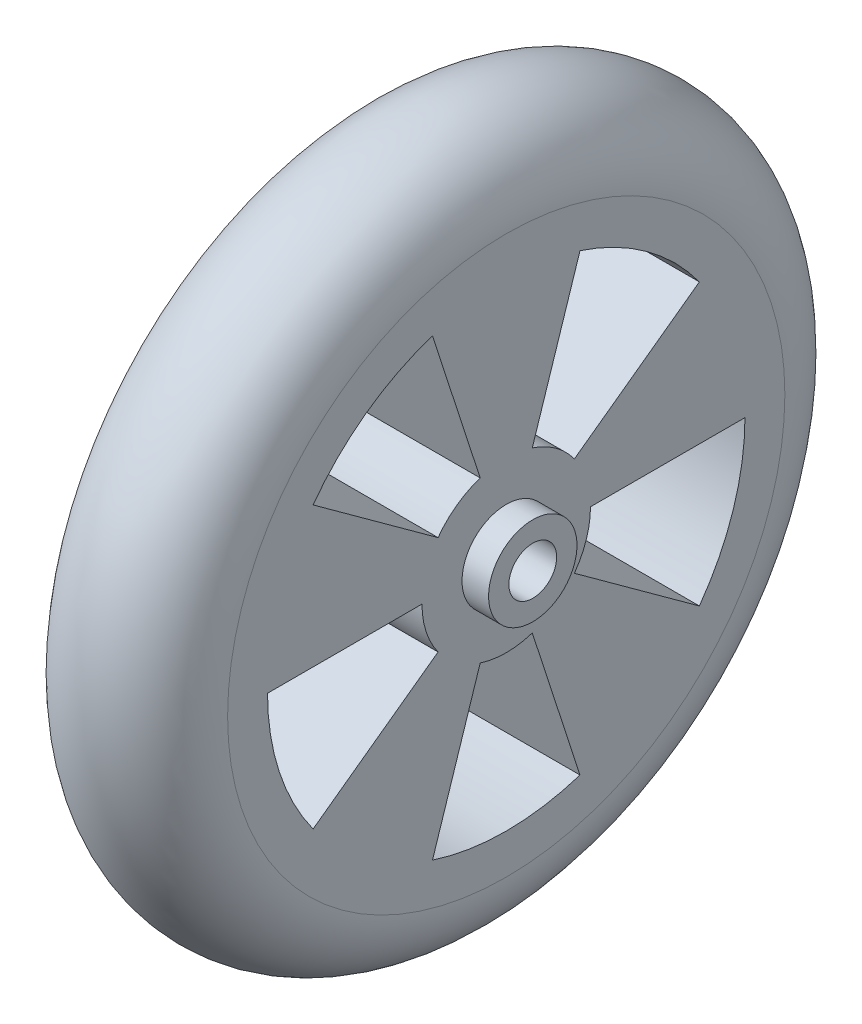
ISO-10303-21;
HEADER;
FILE_DESCRIPTION(('STEP AP214'),'2;1');
FILE_NAME('part.step','',(''),(''),'','','');
FILE_SCHEMA(('AUTOMOTIVE_DESIGN { 1 0 10303 214 1 1 1 1 }'));
ENDSEC;
DATA;
#1=APPLICATION_CONTEXT('core data for automotive mechanical design processes');
#2=APPLICATION_PROTOCOL_DEFINITION('international standard','automotive_design',2000,#1);
#3=PRODUCT_CONTEXT('',#1,'mechanical');
#4=PRODUCT('Part','Part','',(#3));
#5=PRODUCT_RELATED_PRODUCT_CATEGORY('part','',(#4));
#6=PRODUCT_DEFINITION_FORMATION('','',#4);
#7=PRODUCT_DEFINITION_CONTEXT('part definition',#1,'design');
#8=PRODUCT_DEFINITION('design','',#6,#7);
#9=PRODUCT_DEFINITION_SHAPE('','',#8);
#10=(LENGTH_UNIT() NAMED_UNIT(*) SI_UNIT(.MILLI.,.METRE.));
#11=(NAMED_UNIT(*) PLANE_ANGLE_UNIT() SI_UNIT($,.RADIAN.));
#12=(NAMED_UNIT(*) SI_UNIT($,.STERADIAN.) SOLID_ANGLE_UNIT());
#13=UNCERTAINTY_MEASURE_WITH_UNIT(LENGTH_MEASURE(1.E-05),#10,'distance_accuracy_value','');
#14=(GEOMETRIC_REPRESENTATION_CONTEXT(3) GLOBAL_UNCERTAINTY_ASSIGNED_CONTEXT((#13)) GLOBAL_UNIT_ASSIGNED_CONTEXT((#10,
#11,#12)) REPRESENTATION_CONTEXT('',''));
#15=CARTESIAN_POINT('',(0.,0.,0.));
#16=DIRECTION('',(0.,0.,1.));
#17=DIRECTION('',(1.,0.,0.));
#18=AXIS2_PLACEMENT_3D('',#15,#16,#17);
#19=CARTESIAN_POINT('',(8.5,0.,0.));
#20=DIRECTION('',(-1.,0.,0.));
#21=DIRECTION('',(0.,0.,1.));
#22=AXIS2_PLACEMENT_3D('',#19,#20,#21);
#23=TOROIDAL_SURFACE('',#22,31.5,8.5);
#24=CARTESIAN_POINT('',(0.,0.,0.));
#25=DIRECTION('',(-1.,0.,0.));
#26=DIRECTION('',(0.,0.,1.));
#27=AXIS2_PLACEMENT_3D('',#24,#25,#26);
#28=CIRCLE('',#27,31.5);
#29=CARTESIAN_POINT('',(0.,0.,31.5));
#30=VERTEX_POINT('',#29);
#31=EDGE_CURVE('E387',#30,#30,#28,.T.);
#32=ORIENTED_EDGE('',*,*,#31,.F.);
#33=EDGE_LOOP('',(#32));
#34=FACE_BOUND('',#33,.T.);
#35=CARTESIAN_POINT('',(17.,0.,0.));
#36=DIRECTION('',(-1.,0.,0.));
#37=DIRECTION('',(0.,0.,1.));
#38=AXIS2_PLACEMENT_3D('',#35,#36,#37);
#39=CIRCLE('',#38,31.5);
#40=CARTESIAN_POINT('',(17.,0.,31.5));
#41=VERTEX_POINT('',#40);
#42=EDGE_CURVE('E12',#41,#41,#39,.T.);
#43=ORIENTED_EDGE('',*,*,#42,.T.);
#44=EDGE_LOOP('',(#43));
#45=FACE_BOUND('',#44,.T.);
#46=ADVANCED_FACE('F84',(#34,#45),#23,.T.);
#47=CARTESIAN_POINT('',(17.,5.,0.));
#48=DIRECTION('',(-1.,0.,0.));
#49=DIRECTION('',(0.,0.,1.));
#50=AXIS2_PLACEMENT_3D('',#47,#48,#49);
#51=PLANE('',#50);
#52=DIRECTION('',(0.,0.951056516295154,-0.309016994374948));
#53=VECTOR('',#52,1.);
#54=CARTESIAN_POINT('',(17.,4.52254248593737,-1.46946313073119));
#55=LINE('',#54,#53);
#56=CARTESIAN_POINT('',(17.,9.05881331771134,-2.94338687142138));
#57=VERTEX_POINT('',#56);
#58=CARTESIAN_POINT('',(17.,25.6666377335155,-8.33959613569391));
#59=VERTEX_POINT('',#58);
#60=EDGE_CURVE('E377',#57,#59,#55,.T.);
#61=ORIENTED_EDGE('',*,*,#60,.T.);
#62=CARTESIAN_POINT('',(17.,0.,0.));
#63=DIRECTION('',(-1.,0.,0.));
#64=DIRECTION('',(0.,0.,1.));
#65=AXIS2_PLACEMENT_3D('',#62,#63,#64);
#66=CIRCLE('',#65,26.9875);
#67=CARTESIAN_POINT('',(17.,15.8628544962431,-21.8333461356939));
#68=VERTEX_POINT('',#67);
#69=EDGE_CURVE('E380',#59,#68,#66,.T.);
#70=ORIENTED_EDGE('',*,*,#69,.T.);
#71=DIRECTION('',(0.,0.587785252292472,-0.809016994374949));
#72=VECTOR('',#71,1.);
#73=CARTESIAN_POINT('',(17.,1.72745751406262,-2.37764129073788));
#74=LINE('',#73,#72);
#75=CARTESIAN_POINT('',(17.,5.59865452808579,-7.70588687142139));
#76=VERTEX_POINT('',#75);
#77=EDGE_CURVE('E373',#76,#68,#74,.T.);
#78=ORIENTED_EDGE('',*,*,#77,.F.);
#79=CARTESIAN_POINT('',(17.,0.,0.));
#80=DIRECTION('',(-1.,0.,0.));
#81=DIRECTION('',(0.,0.,1.));
#82=AXIS2_PLACEMENT_3D('',#79,#80,#81);
#83=CIRCLE('',#82,9.525);
#84=EDGE_CURVE('E375',#57,#76,#83,.T.);
#85=ORIENTED_EDGE('',*,*,#84,.F.);
#86=EDGE_LOOP('',(#61,#70,#78,#85));
#87=FACE_BOUND('',#86,.T.);
#88=CARTESIAN_POINT('',(17.,0.,0.));
#89=DIRECTION('',(-1.,0.,0.));
#90=DIRECTION('',(0.,0.,1.));
#91=AXIS2_PLACEMENT_3D('',#88,#89,#90);
#92=CIRCLE('',#91,9.525);
#93=CARTESIAN_POINT('',(17.,0.,-9.525));
#94=VERTEX_POINT('',#93);
#95=CARTESIAN_POINT('',(17.,-5.59865452808585,-7.70588687142135));
#96=VERTEX_POINT('',#95);
#97=EDGE_CURVE('E368',#94,#96,#92,.T.);
#98=ORIENTED_EDGE('',*,*,#97,.F.);
#99=DIRECTION('',(0.,0.,-1.));
#100=VECTOR('',#99,1.);
#101=CARTESIAN_POINT('',(17.,0.,0.));
#102=LINE('',#101,#100);
#103=CARTESIAN_POINT('',(17.,0.,-26.9875));
#104=VERTEX_POINT('',#103);
#105=EDGE_CURVE('E370',#94,#104,#102,.T.);
#106=ORIENTED_EDGE('',*,*,#105,.T.);
#107=CARTESIAN_POINT('',(17.,0.,0.));
#108=DIRECTION('',(-1.,0.,0.));
#109=DIRECTION('',(0.,0.,1.));
#110=AXIS2_PLACEMENT_3D('',#107,#108,#109);
#111=CIRCLE('',#110,26.9875);
#112=CARTESIAN_POINT('',(17.,-15.8628544962432,-21.8333461356938));
#113=VERTEX_POINT('',#112);
#114=EDGE_CURVE('E363',#104,#113,#111,.T.);
#115=ORIENTED_EDGE('',*,*,#114,.T.);
#116=DIRECTION('',(0.,-0.587785252292477,-0.809016994374945));
#117=VECTOR('',#116,1.);
#118=CARTESIAN_POINT('',(17.,1.72745751406265,2.37764129073789));
#119=LINE('',#118,#117);
#120=EDGE_CURVE('E366',#96,#113,#119,.T.);
#121=ORIENTED_EDGE('',*,*,#120,.F.);
#122=EDGE_LOOP('',(#98,#106,#115,#121));
#123=FACE_BOUND('',#122,.T.);
#124=CARTESIAN_POINT('',(17.,0.,0.));
#125=DIRECTION('',(-1.,0.,0.));
#126=DIRECTION('',(0.,0.,1.));
#127=AXIS2_PLACEMENT_3D('',#124,#125,#126);
#128=CIRCLE('',#127,9.525);
#129=CARTESIAN_POINT('',(17.,-5.59865452808573,7.70588687142143));
#130=VERTEX_POINT('',#129);
#131=CARTESIAN_POINT('',(17.,1.03165025541915E-13,9.525));
#132=VERTEX_POINT('',#131);
#133=EDGE_CURVE('E360',#130,#132,#128,.T.);
#134=ORIENTED_EDGE('',*,*,#133,.F.);
#135=DIRECTION('',(0.,-0.587785252292465,0.809016994374953));
#136=VECTOR('',#135,1.);
#137=CARTESIAN_POINT('',(17.,1.72745751406259,-2.37764129073787));
#138=LINE('',#137,#136);
#139=CARTESIAN_POINT('',(17.,-15.8628544962429,21.833346135694));
#140=VERTEX_POINT('',#139);
#141=EDGE_CURVE('E227',#130,#140,#138,.T.);
#142=ORIENTED_EDGE('',*,*,#141,.T.);
#143=CARTESIAN_POINT('',(17.,0.,0.));
#144=DIRECTION('',(-1.,0.,0.));
#145=DIRECTION('',(0.,0.,1.));
#146=AXIS2_PLACEMENT_3D('',#143,#144,#145);
#147=CIRCLE('',#146,26.9875);
#148=CARTESIAN_POINT('',(17.,0.,26.9875));
#149=VERTEX_POINT('',#148);
#150=EDGE_CURVE('E354',#140,#149,#147,.T.);
#151=ORIENTED_EDGE('',*,*,#150,.T.);
#152=DIRECTION('',(0.,0.,1.));
#153=VECTOR('',#152,1.);
#154=CARTESIAN_POINT('',(17.,0.,0.));
#155=LINE('',#154,#153);
#156=EDGE_CURVE('E357',#132,#149,#155,.T.);
#157=ORIENTED_EDGE('',*,*,#156,.F.);
#158=EDGE_LOOP('',(#134,#142,#151,#157));
#159=FACE_BOUND('',#158,.T.);
#160=CARTESIAN_POINT('',(17.,0.,0.));
#161=DIRECTION('',(-1.,0.,0.));
#162=DIRECTION('',(0.,0.,1.));
#163=AXIS2_PLACEMENT_3D('',#160,#161,#162);
#164=CIRCLE('',#163,9.52500000000001);
#165=CARTESIAN_POINT('',(17.,-9.05881331771137,-2.94338687142132));
#166=VERTEX_POINT('',#165);
#167=CARTESIAN_POINT('',(17.,-9.05881331771132,2.94338687142145));
#168=VERTEX_POINT('',#167);
#169=EDGE_CURVE('E349',#166,#168,#164,.T.);
#170=ORIENTED_EDGE('',*,*,#169,.F.);
#171=DIRECTION('',(0.,-0.951056516295156,-0.309016994374941));
#172=VECTOR('',#171,1.);
#173=CARTESIAN_POINT('',(17.,4.52254248593739,1.46946313073116));
#174=LINE('',#173,#172);
#175=CARTESIAN_POINT('',(17.,-25.6666377335155,-8.33959613569373));
#176=VERTEX_POINT('',#175);
#177=EDGE_CURVE('E351',#166,#176,#174,.T.);
#178=ORIENTED_EDGE('',*,*,#177,.T.);
#179=CARTESIAN_POINT('',(17.,0.,0.));
#180=DIRECTION('',(-1.,0.,0.));
#181=DIRECTION('',(0.,0.,1.));
#182=AXIS2_PLACEMENT_3D('',#179,#180,#181);
#183=CIRCLE('',#182,26.9875);
#184=CARTESIAN_POINT('',(17.,-25.6666377335154,8.33959613569409));
#185=VERTEX_POINT('',#184);
#186=EDGE_CURVE('E343',#176,#185,#183,.T.);
#187=ORIENTED_EDGE('',*,*,#186,.T.);
#188=DIRECTION('',(0.,-0.951056516295151,0.309016994374955));
#189=VECTOR('',#188,1.);
#190=CARTESIAN_POINT('',(17.,4.52254248593735,-1.46946313073121));
#191=LINE('',#190,#189);
#192=EDGE_CURVE('E346',#168,#185,#191,.T.);
#193=ORIENTED_EDGE('',*,*,#192,.F.);
#194=EDGE_LOOP('',(#170,#178,#187,#193));
#195=FACE_BOUND('',#194,.T.);
#196=CARTESIAN_POINT('',(17.,0.,0.));
#197=DIRECTION('',(-1.,0.,0.));
#198=DIRECTION('',(0.,0.,1.));
#199=AXIS2_PLACEMENT_3D('',#196,#197,#198);
#200=CIRCLE('',#199,9.525);
#201=CARTESIAN_POINT('',(17.,5.5986545280859,7.70588687142131));
#202=VERTEX_POINT('',#201);
#203=CARTESIAN_POINT('',(17.,9.05881331771138,2.94338687142125));
#204=VERTEX_POINT('',#203);
#205=EDGE_CURVE('E338',#202,#204,#200,.T.);
#206=ORIENTED_EDGE('',*,*,#205,.F.);
#207=DIRECTION('',(0.,0.587785252292483,0.80901699437494));
#208=VECTOR('',#207,1.);
#209=CARTESIAN_POINT('',(17.,1.72745751406269,2.3776412907379));
#210=LINE('',#209,#208);
#211=CARTESIAN_POINT('',(17.,15.8628544962434,21.8333461356937));
#212=VERTEX_POINT('',#211);
#213=EDGE_CURVE('E340',#202,#212,#210,.T.);
#214=ORIENTED_EDGE('',*,*,#213,.T.);
#215=CARTESIAN_POINT('',(17.,0.,0.));
#216=DIRECTION('',(-1.,0.,0.));
#217=DIRECTION('',(0.,0.,1.));
#218=AXIS2_PLACEMENT_3D('',#215,#216,#217);
#219=CIRCLE('',#218,26.9875);
#220=CARTESIAN_POINT('',(17.,25.6666377335156,8.33959613569355));
#221=VERTEX_POINT('',#220);
#222=EDGE_CURVE('E332',#212,#221,#219,.T.);
#223=ORIENTED_EDGE('',*,*,#222,.T.);
#224=DIRECTION('',(0.,0.951056516295158,0.309016994374935));
#225=VECTOR('',#224,1.);
#226=CARTESIAN_POINT('',(17.,4.52254248593741,1.46946313073113));
#227=LINE('',#226,#225);
#228=EDGE_CURVE('E335',#204,#221,#227,.T.);
#229=ORIENTED_EDGE('',*,*,#228,.F.);
#230=EDGE_LOOP('',(#206,#214,#223,#229));
#231=FACE_BOUND('',#230,.T.);
#232=ORIENTED_EDGE('',*,*,#42,.F.);
#233=EDGE_LOOP('',(#232));
#234=FACE_BOUND('',#233,.T.);
#235=CARTESIAN_POINT('',(17.,0.,0.));
#236=DIRECTION('',(-1.,0.,0.));
#237=DIRECTION('',(0.,0.,1.));
#238=AXIS2_PLACEMENT_3D('',#235,#236,#237);
#239=CIRCLE('',#238,5.);
#240=CARTESIAN_POINT('',(17.,0.,5.));
#241=VERTEX_POINT('',#240);
#242=EDGE_CURVE('E91',#241,#241,#239,.T.);
#243=ORIENTED_EDGE('',*,*,#242,.T.);
#244=EDGE_LOOP('',(#243));
#245=FACE_BOUND('',#244,.T.);
#246=ADVANCED_FACE('F397',(#87,#123,#159,#195,#231,#234,#245),#51,.F.);
#247=CARTESIAN_POINT('',(0.,0.,0.));
#248=DIRECTION('',(-1.,0.,0.));
#249=DIRECTION('',(0.,0.,1.));
#250=AXIS2_PLACEMENT_3D('',#247,#248,#249);
#251=CYLINDRICAL_SURFACE('',#250,5.);
#252=ORIENTED_EDGE('',*,*,#242,.F.);
#253=EDGE_LOOP('',(#252));
#254=FACE_BOUND('',#253,.T.);
#255=CARTESIAN_POINT('',(20.,0.,0.));
#256=DIRECTION('',(-1.,0.,0.));
#257=DIRECTION('',(0.,0.,1.));
#258=AXIS2_PLACEMENT_3D('',#255,#256,#257);
#259=CIRCLE('',#258,5.);
#260=CARTESIAN_POINT('',(20.,0.,5.));
#261=VERTEX_POINT('',#260);
#262=EDGE_CURVE('E392',#261,#261,#259,.T.);
#263=ORIENTED_EDGE('',*,*,#262,.T.);
#264=EDGE_LOOP('',(#263));
#265=FACE_BOUND('',#264,.T.);
#266=ADVANCED_FACE('F399',(#254,#265),#251,.T.);
#267=CARTESIAN_POINT('',(20.,0.,0.));
#268=DIRECTION('',(-1.,0.,0.));
#269=DIRECTION('',(0.,0.,1.));
#270=AXIS2_PLACEMENT_3D('',#267,#268,#269);
#271=PLANE('',#270);
#272=CARTESIAN_POINT('',(20.,0.,0.));
#273=DIRECTION('',(1.,0.,0.));
#274=DIRECTION('',(0.,0.,-1.));
#275=AXIS2_PLACEMENT_3D('',#272,#273,#274);
#276=CIRCLE('',#275,2.7);
#277=CARTESIAN_POINT('',(20.,0.,-2.7));
#278=VERTEX_POINT('',#277);
#279=EDGE_CURVE('E384',#278,#278,#276,.T.);
#280=ORIENTED_EDGE('',*,*,#279,.F.);
#281=EDGE_LOOP('',(#280));
#282=FACE_BOUND('',#281,.T.);
#283=ORIENTED_EDGE('',*,*,#262,.F.);
#284=EDGE_LOOP('',(#283));
#285=FACE_BOUND('',#284,.T.);
#286=ADVANCED_FACE('F402',(#282,#285),#271,.F.);
#287=CARTESIAN_POINT('',(0.,31.5,0.));
#288=DIRECTION('',(1.,0.,0.));
#289=DIRECTION('',(0.,0.,-1.));
#290=AXIS2_PLACEMENT_3D('',#287,#288,#289);
#291=PLANE('',#290);
#292=DIRECTION('',(0.,0.587785252292472,-0.809016994374949));
#293=VECTOR('',#292,1.);
#294=CARTESIAN_POINT('',(0.,0.,0.));
#295=LINE('',#294,#293);
#296=CARTESIAN_POINT('',(0.,5.59865452808579,-7.70588687142139));
#297=VERTEX_POINT('',#296);
#298=CARTESIAN_POINT('',(0.,15.8628544962431,-21.8333461356939));
#299=VERTEX_POINT('',#298);
#300=EDGE_CURVE('E285',#297,#299,#295,.T.);
#301=ORIENTED_EDGE('',*,*,#300,.T.);
#302=CARTESIAN_POINT('',(0.,0.,0.));
#303=DIRECTION('',(1.,0.,0.));
#304=DIRECTION('',(0.,0.,-1.));
#305=AXIS2_PLACEMENT_3D('',#302,#303,#304);
#306=CIRCLE('',#305,26.9875);
#307=CARTESIAN_POINT('',(0.,25.6666377335155,-8.33959613569391));
#308=VERTEX_POINT('',#307);
#309=EDGE_CURVE('E276',#308,#299,#306,.F.);
#310=ORIENTED_EDGE('',*,*,#309,.F.);
#311=DIRECTION('',(0.,0.951056516295153,-0.309016994374948));
#312=VECTOR('',#311,1.);
#313=CARTESIAN_POINT('',(0.,0.,0.));
#314=LINE('',#313,#312);
#315=CARTESIAN_POINT('',(0.,9.05881331771134,-2.94338687142138));
#316=VERTEX_POINT('',#315);
#317=EDGE_CURVE('E278',#316,#308,#314,.T.);
#318=ORIENTED_EDGE('',*,*,#317,.F.);
#319=CARTESIAN_POINT('',(0.,0.,0.));
#320=DIRECTION('',(1.,0.,0.));
#321=DIRECTION('',(0.,0.,-1.));
#322=AXIS2_PLACEMENT_3D('',#319,#320,#321);
#323=CIRCLE('',#322,9.525);
#324=EDGE_CURVE('E282',#316,#297,#323,.F.);
#325=ORIENTED_EDGE('',*,*,#324,.T.);
#326=EDGE_LOOP('',(#301,#310,#318,#325));
#327=FACE_BOUND('',#326,.T.);
#328=CARTESIAN_POINT('',(0.,0.,0.));
#329=DIRECTION('',(1.,0.,0.));
#330=DIRECTION('',(0.,0.,-1.));
#331=AXIS2_PLACEMENT_3D('',#328,#329,#330);
#332=CIRCLE('',#331,26.9875);
#333=CARTESIAN_POINT('',(0.,0.,-26.9875));
#334=VERTEX_POINT('',#333);
#335=CARTESIAN_POINT('',(0.,-15.8628544962432,-21.8333461356938));
#336=VERTEX_POINT('',#335);
#337=EDGE_CURVE('E304',#334,#336,#332,.F.);
#338=ORIENTED_EDGE('',*,*,#337,.F.);
#339=DIRECTION('',(0.,0.,-1.));
#340=VECTOR('',#339,1.);
#341=CARTESIAN_POINT('',(0.,0.,0.));
#342=LINE('',#341,#340);
#343=CARTESIAN_POINT('',(0.,0.,-9.525));
#344=VERTEX_POINT('',#343);
#345=EDGE_CURVE('E275',#344,#334,#342,.T.);
#346=ORIENTED_EDGE('',*,*,#345,.F.);
#347=CARTESIAN_POINT('',(0.,0.,0.));
#348=DIRECTION('',(1.,0.,0.));
#349=DIRECTION('',(0.,0.,-1.));
#350=AXIS2_PLACEMENT_3D('',#347,#348,#349);
#351=CIRCLE('',#350,9.525);
#352=CARTESIAN_POINT('',(0.,-5.59865452808585,-7.70588687142135));
#353=VERTEX_POINT('',#352);
#354=EDGE_CURVE('E298',#344,#353,#351,.F.);
#355=ORIENTED_EDGE('',*,*,#354,.T.);
#356=DIRECTION('',(0.,-0.587785252292477,-0.809016994374945));
#357=VECTOR('',#356,1.);
#358=CARTESIAN_POINT('',(0.,0.,0.));
#359=LINE('',#358,#357);
#360=EDGE_CURVE('E301',#353,#336,#359,.T.);
#361=ORIENTED_EDGE('',*,*,#360,.T.);
#362=EDGE_LOOP('',(#338,#346,#355,#361));
#363=FACE_BOUND('',#362,.T.);
#364=CARTESIAN_POINT('',(0.,0.,0.));
#365=DIRECTION('',(1.,0.,0.));
#366=DIRECTION('',(0.,0.,-1.));
#367=AXIS2_PLACEMENT_3D('',#364,#365,#366);
#368=CIRCLE('',#367,26.9875);
#369=CARTESIAN_POINT('',(0.,-15.8628544962429,21.833346135694));
#370=VERTEX_POINT('',#369);
#371=CARTESIAN_POINT('',(0.,2.92300905702092E-13,26.9875));
#372=VERTEX_POINT('',#371);
#373=EDGE_CURVE('E246',#370,#372,#368,.F.);
#374=ORIENTED_EDGE('',*,*,#373,.F.);
#375=DIRECTION('',(0.,-0.587785252292465,0.809016994374953));
#376=VECTOR('',#375,1.);
#377=CARTESIAN_POINT('',(0.,0.,0.));
#378=LINE('',#377,#376);
#379=CARTESIAN_POINT('',(0.,-5.59865452808573,7.70588687142143));
#380=VERTEX_POINT('',#379);
#381=EDGE_CURVE('E224',#380,#370,#378,.T.);
#382=ORIENTED_EDGE('',*,*,#381,.F.);
#383=CARTESIAN_POINT('',(0.,0.,0.));
#384=DIRECTION('',(1.,0.,0.));
#385=DIRECTION('',(0.,0.,-1.));
#386=AXIS2_PLACEMENT_3D('',#383,#384,#385);
#387=CIRCLE('',#386,9.525);
#388=CARTESIAN_POINT('',(0.,1.03165025541915E-13,9.525));
#389=VERTEX_POINT('',#388);
#390=EDGE_CURVE('E234',#380,#389,#387,.F.);
#391=ORIENTED_EDGE('',*,*,#390,.T.);
#392=DIRECTION('',(0.,0.,1.));
#393=VECTOR('',#392,1.);
#394=CARTESIAN_POINT('',(0.,0.,0.));
#395=LINE('',#394,#393);
#396=EDGE_CURVE('E240',#389,#372,#395,.T.);
#397=ORIENTED_EDGE('',*,*,#396,.T.);
#398=EDGE_LOOP('',(#374,#382,#391,#397));
#399=FACE_BOUND('',#398,.T.);
#400=CARTESIAN_POINT('',(0.,0.,0.));
#401=DIRECTION('',(1.,0.,0.));
#402=DIRECTION('',(0.,0.,-1.));
#403=AXIS2_PLACEMENT_3D('',#400,#401,#402);
#404=CIRCLE('',#403,26.9875);
#405=CARTESIAN_POINT('',(0.,-25.6666377335155,-8.33959613569373));
#406=VERTEX_POINT('',#405);
#407=CARTESIAN_POINT('',(0.,-25.6666377335154,8.33959613569409));
#408=VERTEX_POINT('',#407);
#409=EDGE_CURVE('E263',#406,#408,#404,.F.);
#410=ORIENTED_EDGE('',*,*,#409,.F.);
#411=DIRECTION('',(0.,-0.951056516295156,-0.309016994374941));
#412=VECTOR('',#411,1.);
#413=CARTESIAN_POINT('',(0.,0.,0.));
#414=LINE('',#413,#412);
#415=CARTESIAN_POINT('',(0.,-9.05881331771137,-2.94338687142132));
#416=VERTEX_POINT('',#415);
#417=EDGE_CURVE('E230',#416,#406,#414,.T.);
#418=ORIENTED_EDGE('',*,*,#417,.F.);
#419=CARTESIAN_POINT('',(0.,0.,0.));
#420=DIRECTION('',(1.,0.,0.));
#421=DIRECTION('',(0.,0.,-1.));
#422=AXIS2_PLACEMENT_3D('',#419,#420,#421);
#423=CIRCLE('',#422,9.52500000000001);
#424=CARTESIAN_POINT('',(0.,-9.05881331771132,2.94338687142145));
#425=VERTEX_POINT('',#424);
#426=EDGE_CURVE('E257',#416,#425,#423,.F.);
#427=ORIENTED_EDGE('',*,*,#426,.T.);
#428=DIRECTION('',(0.,-0.951056516295151,0.309016994374955));
#429=VECTOR('',#428,1.);
#430=CARTESIAN_POINT('',(0.,0.,0.));
#431=LINE('',#430,#429);
#432=EDGE_CURVE('E260',#425,#408,#431,.T.);
#433=ORIENTED_EDGE('',*,*,#432,.T.);
#434=EDGE_LOOP('',(#410,#418,#427,#433));
#435=FACE_BOUND('',#434,.T.);
#436=CARTESIAN_POINT('',(0.,0.,0.));
#437=DIRECTION('',(1.,0.,0.));
#438=DIRECTION('',(0.,0.,-1.));
#439=AXIS2_PLACEMENT_3D('',#436,#437,#438);
#440=CIRCLE('',#439,26.9875);
#441=CARTESIAN_POINT('',(0.,15.8628544962434,21.8333461356937));
#442=VERTEX_POINT('',#441);
#443=CARTESIAN_POINT('',(0.,25.6666377335156,8.33959613569355));
#444=VERTEX_POINT('',#443);
#445=EDGE_CURVE('E320',#442,#444,#440,.F.);
#446=ORIENTED_EDGE('',*,*,#445,.F.);
#447=DIRECTION('',(0.,0.587785252292483,0.80901699437494));
#448=VECTOR('',#447,1.);
#449=CARTESIAN_POINT('',(0.,0.,0.));
#450=LINE('',#449,#448);
#451=CARTESIAN_POINT('',(0.,5.5986545280859,7.70588687142131));
#452=VERTEX_POINT('',#451);
#453=EDGE_CURVE('E296',#452,#442,#450,.T.);
#454=ORIENTED_EDGE('',*,*,#453,.F.);
#455=CARTESIAN_POINT('',(0.,0.,0.));
#456=DIRECTION('',(1.,0.,0.));
#457=DIRECTION('',(0.,0.,-1.));
#458=AXIS2_PLACEMENT_3D('',#455,#456,#457);
#459=CIRCLE('',#458,9.525);
#460=CARTESIAN_POINT('',(0.,9.05881331771138,2.94338687142125));
#461=VERTEX_POINT('',#460);
#462=EDGE_CURVE('E314',#452,#461,#459,.F.);
#463=ORIENTED_EDGE('',*,*,#462,.T.);
#464=DIRECTION('',(0.,0.951056516295158,0.309016994374935));
#465=VECTOR('',#464,1.);
#466=CARTESIAN_POINT('',(0.,0.,0.));
#467=LINE('',#466,#465);
#468=EDGE_CURVE('E317',#461,#444,#467,.T.);
#469=ORIENTED_EDGE('',*,*,#468,.T.);
#470=EDGE_LOOP('',(#446,#454,#463,#469));
#471=FACE_BOUND('',#470,.T.);
#472=CARTESIAN_POINT('',(0.,0.,0.));
#473=DIRECTION('',(1.,0.,0.));
#474=DIRECTION('',(0.,0.,-1.));
#475=AXIS2_PLACEMENT_3D('',#472,#473,#474);
#476=CIRCLE('',#475,2.7);
#477=CARTESIAN_POINT('',(0.,0.,-2.7));
#478=VERTEX_POINT('',#477);
#479=EDGE_CURVE('E383',#478,#478,#476,.T.);
#480=ORIENTED_EDGE('',*,*,#479,.T.);
#481=EDGE_LOOP('',(#480));
#482=FACE_BOUND('',#481,.T.);
#483=ORIENTED_EDGE('',*,*,#31,.T.);
#484=EDGE_LOOP('',(#483));
#485=FACE_BOUND('',#484,.T.);
#486=ADVANCED_FACE('F243',(#327,#363,#399,#435,#471,#482,#485),#291,.F.);
#487=CARTESIAN_POINT('',(20.,0.,0.));
#488=DIRECTION('',(-1.,0.,0.));
#489=DIRECTION('',(0.,0.,1.));
#490=AXIS2_PLACEMENT_3D('',#487,#488,#489);
#491=CYLINDRICAL_SURFACE('',#490,2.7);
#492=ORIENTED_EDGE('',*,*,#279,.T.);
#493=EDGE_LOOP('',(#492));
#494=FACE_BOUND('',#493,.T.);
#495=ORIENTED_EDGE('',*,*,#479,.F.);
#496=EDGE_LOOP('',(#495));
#497=FACE_BOUND('',#496,.T.);
#498=ADVANCED_FACE('F412',(#494,#497),#491,.F.);
#499=CARTESIAN_POINT('',(20.,0.,0.));
#500=DIRECTION('',(0.,-0.80901699437494,0.587785252292483));
#501=DIRECTION('',(0.,-0.587785252292483,-0.80901699437494));
#502=AXIS2_PLACEMENT_3D('',#499,#500,#501);
#503=PLANE('',#502);
#504=DIRECTION('',(-1.,0.,0.));
#505=VECTOR('',#504,1.);
#506=CARTESIAN_POINT('',(20.,5.5986545280859,7.70588687142131));
#507=LINE('',#506,#505);
#508=EDGE_CURVE('E330',#202,#452,#507,.T.);
#509=ORIENTED_EDGE('',*,*,#508,.T.);
#510=ORIENTED_EDGE('',*,*,#453,.T.);
#511=DIRECTION('',(-1.,0.,0.));
#512=VECTOR('',#511,1.);
#513=CARTESIAN_POINT('',(20.,15.8628544962434,21.8333461356937));
#514=LINE('',#513,#512);
#515=EDGE_CURVE('E323',#212,#442,#514,.T.);
#516=ORIENTED_EDGE('',*,*,#515,.F.);
#517=ORIENTED_EDGE('',*,*,#213,.F.);
#518=EDGE_LOOP('',(#509,#510,#516,#517));
#519=FACE_BOUND('',#518,.T.);
#520=ADVANCED_FACE('F455',(#519),#503,.F.);
#521=CARTESIAN_POINT('',(20.,0.,0.));
#522=DIRECTION('',(-1.,0.,0.));
#523=DIRECTION('',(0.,0.,1.));
#524=AXIS2_PLACEMENT_3D('',#521,#522,#523);
#525=CYLINDRICAL_SURFACE('',#524,9.525);
#526=ORIENTED_EDGE('',*,*,#205,.T.);
#527=DIRECTION('',(-1.,0.,0.));
#528=VECTOR('',#527,1.);
#529=CARTESIAN_POINT('',(20.,9.05881331771138,2.94338687142125));
#530=LINE('',#529,#528);
#531=EDGE_CURVE('E328',#204,#461,#530,.T.);
#532=ORIENTED_EDGE('',*,*,#531,.T.);
#533=ORIENTED_EDGE('',*,*,#462,.F.);
#534=ORIENTED_EDGE('',*,*,#508,.F.);
#535=EDGE_LOOP('',(#526,#532,#533,#534));
#536=FACE_BOUND('',#535,.T.);
#537=ADVANCED_FACE('F444',(#536),#525,.T.);
#538=CARTESIAN_POINT('',(20.,0.,0.));
#539=DIRECTION('',(0.,-0.309016994374935,0.951056516295158));
#540=DIRECTION('',(0.,-0.951056516295158,-0.309016994374935));
#541=AXIS2_PLACEMENT_3D('',#538,#539,#540);
#542=PLANE('',#541);
#543=ORIENTED_EDGE('',*,*,#228,.T.);
#544=DIRECTION('',(-1.,0.,0.));
#545=VECTOR('',#544,1.);
#546=CARTESIAN_POINT('',(20.,25.6666377335156,8.33959613569355));
#547=LINE('',#546,#545);
#548=EDGE_CURVE('E326',#221,#444,#547,.T.);
#549=ORIENTED_EDGE('',*,*,#548,.T.);
#550=ORIENTED_EDGE('',*,*,#468,.F.);
#551=ORIENTED_EDGE('',*,*,#531,.F.);
#552=EDGE_LOOP('',(#543,#549,#550,#551));
#553=FACE_BOUND('',#552,.T.);
#554=ADVANCED_FACE('F448',(#553),#542,.T.);
#555=CARTESIAN_POINT('',(20.,0.,0.));
#556=DIRECTION('',(-1.,0.,0.));
#557=DIRECTION('',(0.,0.,1.));
#558=AXIS2_PLACEMENT_3D('',#555,#556,#557);
#559=CYLINDRICAL_SURFACE('',#558,26.9875);
#560=ORIENTED_EDGE('',*,*,#515,.T.);
#561=ORIENTED_EDGE('',*,*,#445,.T.);
#562=ORIENTED_EDGE('',*,*,#548,.F.);
#563=ORIENTED_EDGE('',*,*,#222,.F.);
#564=EDGE_LOOP('',(#560,#561,#562,#563));
#565=FACE_BOUND('',#564,.T.);
#566=ADVANCED_FACE('F457',(#565),#559,.F.);
#567=CARTESIAN_POINT('',(20.,0.,0.));
#568=DIRECTION('',(0.,0.309016994374941,-0.951056516295156));
#569=DIRECTION('',(0.,0.951056516295156,0.309016994374941));
#570=AXIS2_PLACEMENT_3D('',#567,#568,#569);
#571=PLANE('',#570);
#572=DIRECTION('',(-1.,0.,0.));
#573=VECTOR('',#572,1.);
#574=CARTESIAN_POINT('',(20.,-9.05881331771137,-2.94338687142132));
#575=LINE('',#574,#573);
#576=EDGE_CURVE('E273',#166,#416,#575,.T.);
#577=ORIENTED_EDGE('',*,*,#576,.T.);
#578=ORIENTED_EDGE('',*,*,#417,.T.);
#579=DIRECTION('',(-1.,0.,0.));
#580=VECTOR('',#579,1.);
#581=CARTESIAN_POINT('',(20.,-25.6666377335155,-8.33959613569373));
#582=LINE('',#581,#580);
#583=EDGE_CURVE('E266',#176,#406,#582,.T.);
#584=ORIENTED_EDGE('',*,*,#583,.F.);
#585=ORIENTED_EDGE('',*,*,#177,.F.);
#586=EDGE_LOOP('',(#577,#578,#584,#585));
#587=FACE_BOUND('',#586,.T.);
#588=ADVANCED_FACE('F459',(#587),#571,.F.);
#589=CARTESIAN_POINT('',(20.,0.,0.));
#590=DIRECTION('',(-1.,0.,0.));
#591=DIRECTION('',(0.,0.,1.));
#592=AXIS2_PLACEMENT_3D('',#589,#590,#591);
#593=CYLINDRICAL_SURFACE('',#592,9.52500000000001);
#594=ORIENTED_EDGE('',*,*,#169,.T.);
#595=DIRECTION('',(-1.,0.,0.));
#596=VECTOR('',#595,1.);
#597=CARTESIAN_POINT('',(20.,-9.05881331771132,2.94338687142145));
#598=LINE('',#597,#596);
#599=EDGE_CURVE('E271',#168,#425,#598,.T.);
#600=ORIENTED_EDGE('',*,*,#599,.T.);
#601=ORIENTED_EDGE('',*,*,#426,.F.);
#602=ORIENTED_EDGE('',*,*,#576,.F.);
#603=EDGE_LOOP('',(#594,#600,#601,#602));
#604=FACE_BOUND('',#603,.T.);
#605=ADVANCED_FACE('F465',(#604),#593,.T.);
#606=CARTESIAN_POINT('',(20.,0.,0.));
#607=DIRECTION('',(0.,-0.309016994374955,-0.951056516295151));
#608=DIRECTION('',(0.,0.951056516295151,-0.309016994374955));
#609=AXIS2_PLACEMENT_3D('',#606,#607,#608);
#610=PLANE('',#609);
#611=ORIENTED_EDGE('',*,*,#192,.T.);
#612=DIRECTION('',(-1.,0.,0.));
#613=VECTOR('',#612,1.);
#614=CARTESIAN_POINT('',(20.,-25.6666377335154,8.33959613569409));
#615=LINE('',#614,#613);
#616=EDGE_CURVE('E269',#185,#408,#615,.T.);
#617=ORIENTED_EDGE('',*,*,#616,.T.);
#618=ORIENTED_EDGE('',*,*,#432,.F.);
#619=ORIENTED_EDGE('',*,*,#599,.F.);
#620=EDGE_LOOP('',(#611,#617,#618,#619));
#621=FACE_BOUND('',#620,.T.);
#622=ADVANCED_FACE('F516',(#621),#610,.T.);
#623=CARTESIAN_POINT('',(20.,0.,0.));
#624=DIRECTION('',(-1.,0.,0.));
#625=DIRECTION('',(0.,0.,1.));
#626=AXIS2_PLACEMENT_3D('',#623,#624,#625);
#627=CYLINDRICAL_SURFACE('',#626,26.9875);
#628=ORIENTED_EDGE('',*,*,#583,.T.);
#629=ORIENTED_EDGE('',*,*,#409,.T.);
#630=ORIENTED_EDGE('',*,*,#616,.F.);
#631=ORIENTED_EDGE('',*,*,#186,.F.);
#632=EDGE_LOOP('',(#628,#629,#630,#631));
#633=FACE_BOUND('',#632,.T.);
#634=ADVANCED_FACE('F526',(#633),#627,.F.);
#635=CARTESIAN_POINT('',(20.,0.,0.));
#636=DIRECTION('',(0.,-0.809016994374953,-0.587785252292465));
#637=DIRECTION('',(0.,0.587785252292465,-0.809016994374953));
#638=AXIS2_PLACEMENT_3D('',#635,#636,#637);
#639=PLANE('',#638);
#640=DIRECTION('',(-1.,0.,0.));
#641=VECTOR('',#640,1.);
#642=CARTESIAN_POINT('',(20.,-5.59865452808573,7.70588687142143));
#643=LINE('',#642,#641);
#644=EDGE_CURVE('E219',#130,#380,#643,.T.);
#645=ORIENTED_EDGE('',*,*,#644,.T.);
#646=ORIENTED_EDGE('',*,*,#381,.T.);
#647=DIRECTION('',(-1.,0.,0.));
#648=VECTOR('',#647,1.);
#649=CARTESIAN_POINT('',(20.,-15.8628544962429,21.833346135694));
#650=LINE('',#649,#648);
#651=EDGE_CURVE('E251',#140,#370,#650,.T.);
#652=ORIENTED_EDGE('',*,*,#651,.F.);
#653=ORIENTED_EDGE('',*,*,#141,.F.);
#654=EDGE_LOOP('',(#645,#646,#652,#653));
#655=FACE_BOUND('',#654,.T.);
#656=ADVANCED_FACE('F221',(#655),#639,.F.);
#657=CARTESIAN_POINT('',(20.,0.,0.));
#658=DIRECTION('',(-1.,0.,0.));
#659=DIRECTION('',(0.,0.,1.));
#660=AXIS2_PLACEMENT_3D('',#657,#658,#659);
#661=CYLINDRICAL_SURFACE('',#660,9.525);
#662=ORIENTED_EDGE('',*,*,#133,.T.);
#663=DIRECTION('',(-1.,0.,0.));
#664=VECTOR('',#663,1.);
#665=CARTESIAN_POINT('',(20.,1.03165025541915E-13,9.525));
#666=LINE('',#665,#664);
#667=EDGE_CURVE('E231',#132,#389,#666,.T.);
#668=ORIENTED_EDGE('',*,*,#667,.T.);
#669=ORIENTED_EDGE('',*,*,#390,.F.);
#670=ORIENTED_EDGE('',*,*,#644,.F.);
#671=EDGE_LOOP('',(#662,#668,#669,#670));
#672=FACE_BOUND('',#671,.T.);
#673=ADVANCED_FACE('F235',(#672),#661,.T.);
#674=CARTESIAN_POINT('',(20.,0.,0.));
#675=DIRECTION('',(0.,-1.,0.));
#676=DIRECTION('',(0.,0.,-1.));
#677=AXIS2_PLACEMENT_3D('',#674,#675,#676);
#678=PLANE('',#677);
#679=ORIENTED_EDGE('',*,*,#156,.T.);
#680=DIRECTION('',(-1.,0.,0.));
#681=VECTOR('',#680,1.);
#682=CARTESIAN_POINT('',(20.,2.92300905702092E-13,26.9875));
#683=LINE('',#682,#681);
#684=EDGE_CURVE('E253',#149,#372,#683,.T.);
#685=ORIENTED_EDGE('',*,*,#684,.T.);
#686=ORIENTED_EDGE('',*,*,#396,.F.);
#687=ORIENTED_EDGE('',*,*,#667,.F.);
#688=EDGE_LOOP('',(#679,#685,#686,#687));
#689=FACE_BOUND('',#688,.T.);
#690=ADVANCED_FACE('F553',(#689),#678,.T.);
#691=CARTESIAN_POINT('',(20.,0.,0.));
#692=DIRECTION('',(-1.,0.,0.));
#693=DIRECTION('',(0.,0.,1.));
#694=AXIS2_PLACEMENT_3D('',#691,#692,#693);
#695=CYLINDRICAL_SURFACE('',#694,26.9875);
#696=ORIENTED_EDGE('',*,*,#651,.T.);
#697=ORIENTED_EDGE('',*,*,#373,.T.);
#698=ORIENTED_EDGE('',*,*,#684,.F.);
#699=ORIENTED_EDGE('',*,*,#150,.F.);
#700=EDGE_LOOP('',(#696,#697,#698,#699));
#701=FACE_BOUND('',#700,.T.);
#702=ADVANCED_FACE('F562',(#701),#695,.F.);
#703=CARTESIAN_POINT('',(20.,0.,0.));
#704=DIRECTION('',(0.,1.,0.));
#705=DIRECTION('',(0.,0.,1.));
#706=AXIS2_PLACEMENT_3D('',#703,#704,#705);
#707=PLANE('',#706);
#708=DIRECTION('',(-1.,0.,0.));
#709=VECTOR('',#708,1.);
#710=CARTESIAN_POINT('',(20.,0.,-9.525));
#711=LINE('',#710,#709);
#712=EDGE_CURVE('E279',#94,#344,#711,.T.);
#713=ORIENTED_EDGE('',*,*,#712,.T.);
#714=ORIENTED_EDGE('',*,*,#345,.T.);
#715=DIRECTION('',(-1.,0.,0.));
#716=VECTOR('',#715,1.);
#717=CARTESIAN_POINT('',(20.,0.,-26.9875));
#718=LINE('',#717,#716);
#719=EDGE_CURVE('E306',#104,#334,#718,.T.);
#720=ORIENTED_EDGE('',*,*,#719,.F.);
#721=ORIENTED_EDGE('',*,*,#105,.F.);
#722=EDGE_LOOP('',(#713,#714,#720,#721));
#723=FACE_BOUND('',#722,.T.);
#724=ADVANCED_FACE('F470',(#723),#707,.F.);
#725=CARTESIAN_POINT('',(20.,0.,0.));
#726=DIRECTION('',(-1.,0.,0.));
#727=DIRECTION('',(0.,0.,1.));
#728=AXIS2_PLACEMENT_3D('',#725,#726,#727);
#729=CYLINDRICAL_SURFACE('',#728,9.525);
#730=ORIENTED_EDGE('',*,*,#97,.T.);
#731=DIRECTION('',(-1.,0.,0.));
#732=VECTOR('',#731,1.);
#733=CARTESIAN_POINT('',(20.,-5.59865452808585,-7.70588687142135));
#734=LINE('',#733,#732);
#735=EDGE_CURVE('E310',#96,#353,#734,.T.);
#736=ORIENTED_EDGE('',*,*,#735,.T.);
#737=ORIENTED_EDGE('',*,*,#354,.F.);
#738=ORIENTED_EDGE('',*,*,#712,.F.);
#739=EDGE_LOOP('',(#730,#736,#737,#738));
#740=FACE_BOUND('',#739,.T.);
#741=ADVANCED_FACE('F581',(#740),#729,.T.);
#742=CARTESIAN_POINT('',(20.,0.,0.));
#743=DIRECTION('',(0.,0.809016994374944,-0.587785252292477));
#744=DIRECTION('',(0.,0.587785252292477,0.809016994374945));
#745=AXIS2_PLACEMENT_3D('',#742,#743,#744);
#746=PLANE('',#745);
#747=ORIENTED_EDGE('',*,*,#120,.T.);
#748=DIRECTION('',(-1.,0.,0.));
#749=VECTOR('',#748,1.);
#750=CARTESIAN_POINT('',(20.,-15.8628544962432,-21.8333461356938));
#751=LINE('',#750,#749);
#752=EDGE_CURVE('E106',#113,#336,#751,.T.);
#753=ORIENTED_EDGE('',*,*,#752,.T.);
#754=ORIENTED_EDGE('',*,*,#360,.F.);
#755=ORIENTED_EDGE('',*,*,#735,.F.);
#756=EDGE_LOOP('',(#747,#753,#754,#755));
#757=FACE_BOUND('',#756,.T.);
#758=ADVANCED_FACE('F590',(#757),#746,.T.);
#759=CARTESIAN_POINT('',(20.,0.,0.));
#760=DIRECTION('',(-1.,0.,0.));
#761=DIRECTION('',(0.,0.,1.));
#762=AXIS2_PLACEMENT_3D('',#759,#760,#761);
#763=CYLINDRICAL_SURFACE('',#762,26.9875);
#764=ORIENTED_EDGE('',*,*,#719,.T.);
#765=ORIENTED_EDGE('',*,*,#337,.T.);
#766=ORIENTED_EDGE('',*,*,#752,.F.);
#767=ORIENTED_EDGE('',*,*,#114,.F.);
#768=EDGE_LOOP('',(#764,#765,#766,#767));
#769=FACE_BOUND('',#768,.T.);
#770=ADVANCED_FACE('F599',(#769),#763,.F.);
#771=CARTESIAN_POINT('',(20.,0.,0.));
#772=DIRECTION('',(-1.,0.,0.));
#773=DIRECTION('',(0.,0.,1.));
#774=AXIS2_PLACEMENT_3D('',#771,#772,#773);
#775=CYLINDRICAL_SURFACE('',#774,26.9875);
#776=DIRECTION('',(-1.,0.,0.));
#777=VECTOR('',#776,1.);
#778=CARTESIAN_POINT('',(20.,25.6666377335155,-8.33959613569391));
#779=LINE('',#778,#777);
#780=EDGE_CURVE('E294',#59,#308,#779,.T.);
#781=ORIENTED_EDGE('',*,*,#780,.T.);
#782=ORIENTED_EDGE('',*,*,#309,.T.);
#783=DIRECTION('',(-1.,0.,0.));
#784=VECTOR('',#783,1.);
#785=CARTESIAN_POINT('',(20.,15.8628544962431,-21.8333461356939));
#786=LINE('',#785,#784);
#787=EDGE_CURVE('E288',#68,#299,#786,.T.);
#788=ORIENTED_EDGE('',*,*,#787,.F.);
#789=ORIENTED_EDGE('',*,*,#69,.F.);
#790=EDGE_LOOP('',(#781,#782,#788,#789));
#791=FACE_BOUND('',#790,.T.);
#792=ADVANCED_FACE('F609',(#791),#775,.F.);
#793=CARTESIAN_POINT('',(20.,0.,0.));
#794=DIRECTION('',(0.,0.309016994374948,0.951056516295153));
#795=DIRECTION('',(0.,-0.951056516295154,0.309016994374948));
#796=AXIS2_PLACEMENT_3D('',#793,#794,#795);
#797=PLANE('',#796);
#798=DIRECTION('',(-1.,0.,0.));
#799=VECTOR('',#798,1.);
#800=CARTESIAN_POINT('',(20.,9.05881331771134,-2.94338687142138));
#801=LINE('',#800,#799);
#802=EDGE_CURVE('E292',#57,#316,#801,.T.);
#803=ORIENTED_EDGE('',*,*,#802,.T.);
#804=ORIENTED_EDGE('',*,*,#317,.T.);
#805=ORIENTED_EDGE('',*,*,#780,.F.);
#806=ORIENTED_EDGE('',*,*,#60,.F.);
#807=EDGE_LOOP('',(#803,#804,#805,#806));
#808=FACE_BOUND('',#807,.T.);
#809=ADVANCED_FACE('F618',(#808),#797,.F.);
#810=CARTESIAN_POINT('',(20.,0.,0.));
#811=DIRECTION('',(-1.,0.,0.));
#812=DIRECTION('',(0.,0.,1.));
#813=AXIS2_PLACEMENT_3D('',#810,#811,#812);
#814=CYLINDRICAL_SURFACE('',#813,9.525);
#815=ORIENTED_EDGE('',*,*,#84,.T.);
#816=DIRECTION('',(-1.,0.,0.));
#817=VECTOR('',#816,1.);
#818=CARTESIAN_POINT('',(20.,5.59865452808579,-7.70588687142139));
#819=LINE('',#818,#817);
#820=EDGE_CURVE('E98',#76,#297,#819,.T.);
#821=ORIENTED_EDGE('',*,*,#820,.T.);
#822=ORIENTED_EDGE('',*,*,#324,.F.);
#823=ORIENTED_EDGE('',*,*,#802,.F.);
#824=EDGE_LOOP('',(#815,#821,#822,#823));
#825=FACE_BOUND('',#824,.T.);
#826=ADVANCED_FACE('F628',(#825),#814,.T.);
#827=CARTESIAN_POINT('',(20.,0.,0.));
#828=DIRECTION('',(0.,0.809016994374949,0.587785252292471));
#829=DIRECTION('',(0.,-0.587785252292472,0.809016994374949));
#830=AXIS2_PLACEMENT_3D('',#827,#828,#829);
#831=PLANE('',#830);
#832=ORIENTED_EDGE('',*,*,#77,.T.);
#833=ORIENTED_EDGE('',*,*,#787,.T.);
#834=ORIENTED_EDGE('',*,*,#300,.F.);
#835=ORIENTED_EDGE('',*,*,#820,.F.);
#836=EDGE_LOOP('',(#832,#833,#834,#835));
#837=FACE_BOUND('',#836,.T.);
#838=ADVANCED_FACE('F638',(#837),#831,.T.);
#839=CLOSED_SHELL('',(#46,#246,#266,#286,#486,#498,#520,#537,#554,#566,#588,#605,#622,#634,#656,
#673,#690,#702,#724,#741,#758,#770,#792,#809,#826,#838));
#840=MANIFOLD_SOLID_BREP('B2',#839);
#841=ADVANCED_BREP_SHAPE_REPRESENTATION('',(#18,#840),#14);
#842=SHAPE_DEFINITION_REPRESENTATION(#9,#841);
ENDSEC;
END-ISO-10303-21;
